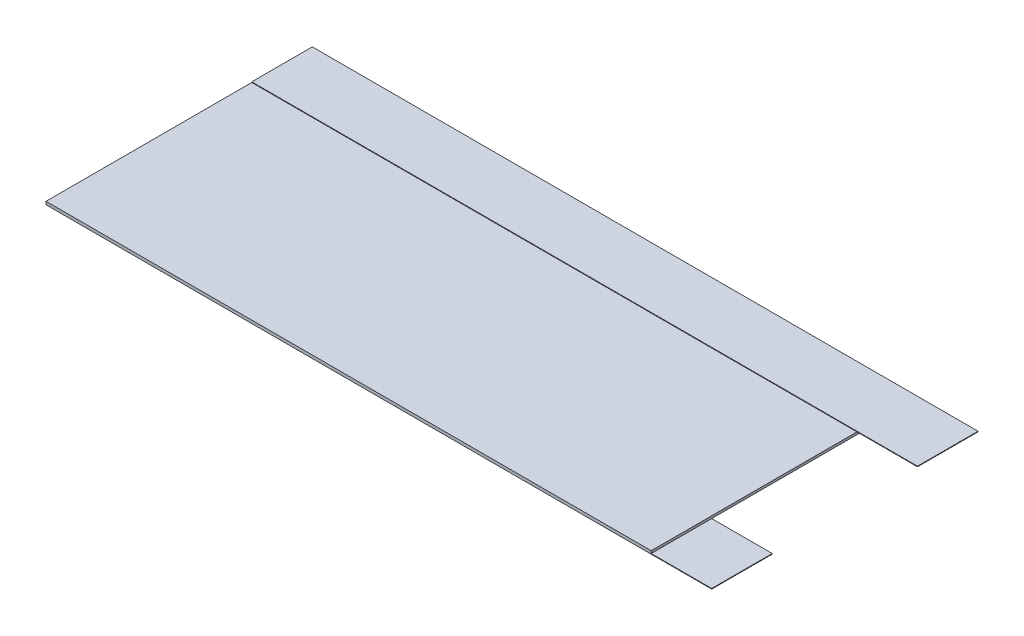
ISO-10303-21;
HEADER;
FILE_DESCRIPTION(('STEP AP214'),'2;1');
FILE_NAME('part.step','',(''),(''),'','','');
FILE_SCHEMA(('AUTOMOTIVE_DESIGN { 1 0 10303 214 1 1 1 1 }'));
ENDSEC;
DATA;
#1=APPLICATION_CONTEXT('core data for automotive mechanical design processes');
#2=APPLICATION_PROTOCOL_DEFINITION('international standard','automotive_design',2000,#1);
#3=PRODUCT_CONTEXT('',#1,'mechanical');
#4=PRODUCT('Part','Part','',(#3));
#5=PRODUCT_RELATED_PRODUCT_CATEGORY('part','',(#4));
#6=PRODUCT_DEFINITION_FORMATION('','',#4);
#7=PRODUCT_DEFINITION_CONTEXT('part definition',#1,'design');
#8=PRODUCT_DEFINITION('design','',#6,#7);
#9=PRODUCT_DEFINITION_SHAPE('','',#8);
#10=(LENGTH_UNIT() NAMED_UNIT(*) SI_UNIT(.MILLI.,.METRE.));
#11=(NAMED_UNIT(*) PLANE_ANGLE_UNIT() SI_UNIT($,.RADIAN.));
#12=(NAMED_UNIT(*) SI_UNIT($,.STERADIAN.) SOLID_ANGLE_UNIT());
#13=UNCERTAINTY_MEASURE_WITH_UNIT(LENGTH_MEASURE(1.E-05),#10,'distance_accuracy_value','');
#14=(GEOMETRIC_REPRESENTATION_CONTEXT(3) GLOBAL_UNCERTAINTY_ASSIGNED_CONTEXT((#13)) GLOBAL_UNIT_ASSIGNED_CONTEXT((#10,
#11,#12)) REPRESENTATION_CONTEXT('',''));
#15=CARTESIAN_POINT('',(0.,0.,0.));
#16=DIRECTION('',(0.,0.,1.));
#17=DIRECTION('',(1.,0.,0.));
#18=AXIS2_PLACEMENT_3D('',#15,#16,#17);
#19=CARTESIAN_POINT('',(0.,-0.1,0.));
#20=DIRECTION('',(0.,1.,0.));
#21=DIRECTION('',(0.,0.,1.));
#22=AXIS2_PLACEMENT_3D('',#19,#20,#21);
#23=PLANE('',#22);
#24=DIRECTION('',(1.,0.,0.));
#25=VECTOR('',#24,1.);
#26=CARTESIAN_POINT('',(-25.,-0.1,6.));
#27=LINE('',#26,#25);
#28=CARTESIAN_POINT('',(-25.,-0.1,6.));
#29=VERTEX_POINT('',#28);
#30=CARTESIAN_POINT('',(25.,-0.1,6.));
#31=VERTEX_POINT('',#30);
#32=EDGE_CURVE('E54',#29,#31,#27,.T.);
#33=ORIENTED_EDGE('',*,*,#32,.F.);
#34=DIRECTION('',(0.,0.,-1.));
#35=VECTOR('',#34,1.);
#36=CARTESIAN_POINT('',(-25.,-0.1,-11.));
#37=LINE('',#36,#35);
#38=CARTESIAN_POINT('',(-25.,-0.1,-11.));
#39=VERTEX_POINT('',#38);
#40=EDGE_CURVE('E190',#29,#39,#37,.T.);
#41=ORIENTED_EDGE('',*,*,#40,.T.);
#42=DIRECTION('',(1.,0.,0.));
#43=VECTOR('',#42,1.);
#44=CARTESIAN_POINT('',(-25.,-0.1,-11.));
#45=LINE('',#44,#43);
#46=CARTESIAN_POINT('',(25.,-0.1,-11.));
#47=VERTEX_POINT('',#46);
#48=EDGE_CURVE('E59',#39,#47,#45,.T.);
#49=ORIENTED_EDGE('',*,*,#48,.T.);
#50=DIRECTION('',(0.,0.,1.));
#51=VECTOR('',#50,1.);
#52=CARTESIAN_POINT('',(25.,-0.1,-11.));
#53=LINE('',#52,#51);
#54=EDGE_CURVE('E202',#47,#31,#53,.T.);
#55=ORIENTED_EDGE('',*,*,#54,.T.);
#56=EDGE_LOOP('',(#33,#41,#49,#55));
#57=FACE_BOUND('',#56,.T.);
#58=ADVANCED_FACE('F37',(#57),#23,.F.);
#59=CARTESIAN_POINT('',(25.,-0.1,-11.));
#60=DIRECTION('',(-1.,0.,0.));
#61=DIRECTION('',(0.,0.,-1.));
#62=AXIS2_PLACEMENT_3D('',#59,#60,#61);
#63=PLANE('',#62);
#64=DIRECTION('',(0.,1.,0.));
#65=VECTOR('',#64,1.);
#66=CARTESIAN_POINT('',(25.,-0.1,-11.));
#67=LINE('',#66,#65);
#68=CARTESIAN_POINT('',(25.,0.1,-11.));
#69=VERTEX_POINT('',#68);
#70=EDGE_CURVE('E211',#47,#69,#67,.T.);
#71=ORIENTED_EDGE('',*,*,#70,.T.);
#72=DIRECTION('',(0.,0.,-1.));
#73=VECTOR('',#72,1.);
#74=CARTESIAN_POINT('',(25.,0.1,11.));
#75=LINE('',#74,#73);
#76=CARTESIAN_POINT('',(25.,0.1,-6.));
#77=VERTEX_POINT('',#76);
#78=EDGE_CURVE('E146',#77,#69,#75,.T.);
#79=ORIENTED_EDGE('',*,*,#78,.F.);
#80=CARTESIAN_POINT('',(25.,0.1,11.));
#81=VERTEX_POINT('',#80);
#82=EDGE_CURVE('E149',#81,#77,#75,.T.);
#83=ORIENTED_EDGE('',*,*,#82,.F.);
#84=DIRECTION('',(0.,1.,0.));
#85=VECTOR('',#84,1.);
#86=CARTESIAN_POINT('',(25.,-0.1,11.));
#87=LINE('',#86,#85);
#88=CARTESIAN_POINT('',(25.,-0.1,11.));
#89=VERTEX_POINT('',#88);
#90=EDGE_CURVE('E11',#89,#81,#87,.T.);
#91=ORIENTED_EDGE('',*,*,#90,.F.);
#92=EDGE_CURVE('E196',#31,#89,#53,.T.);
#93=ORIENTED_EDGE('',*,*,#92,.F.);
#94=ORIENTED_EDGE('',*,*,#54,.F.);
#95=EDGE_LOOP('',(#71,#79,#83,#91,#93,#94));
#96=FACE_BOUND('',#95,.T.);
#97=ADVANCED_FACE('F39',(#96),#63,.F.);
#98=CARTESIAN_POINT('',(-25.,-0.1,11.));
#99=DIRECTION('',(0.,0.,-1.));
#100=DIRECTION('',(1.,0.,0.));
#101=AXIS2_PLACEMENT_3D('',#98,#99,#100);
#102=PLANE('',#101);
#103=ORIENTED_EDGE('',*,*,#90,.T.);
#104=DIRECTION('',(1.,0.,0.));
#105=VECTOR('',#104,1.);
#106=CARTESIAN_POINT('',(-25.,0.1,11.));
#107=LINE('',#106,#105);
#108=CARTESIAN_POINT('',(-25.,0.1,11.));
#109=VERTEX_POINT('',#108);
#110=EDGE_CURVE('E169',#109,#81,#107,.T.);
#111=ORIENTED_EDGE('',*,*,#110,.F.);
#112=DIRECTION('',(0.,1.,0.));
#113=VECTOR('',#112,1.);
#114=CARTESIAN_POINT('',(-25.,-0.1,11.));
#115=LINE('',#114,#113);
#116=CARTESIAN_POINT('',(-25.,-0.15,11.));
#117=VERTEX_POINT('',#116);
#118=EDGE_CURVE('E46',#117,#109,#115,.T.);
#119=ORIENTED_EDGE('',*,*,#118,.F.);
#120=DIRECTION('',(-1.,0.,0.));
#121=VECTOR('',#120,1.);
#122=CARTESIAN_POINT('',(-25.,-0.15,11.));
#123=LINE('',#122,#121);
#124=CARTESIAN_POINT('',(30.,-0.15,11.));
#125=VERTEX_POINT('',#124);
#126=EDGE_CURVE('E185',#125,#117,#123,.T.);
#127=ORIENTED_EDGE('',*,*,#126,.F.);
#128=DIRECTION('',(0.,1.,0.));
#129=VECTOR('',#128,1.);
#130=CARTESIAN_POINT('',(30.,-0.15,11.));
#131=LINE('',#130,#129);
#132=CARTESIAN_POINT('',(30.,-0.1,11.));
#133=VERTEX_POINT('',#132);
#134=EDGE_CURVE('E226',#125,#133,#131,.T.);
#135=ORIENTED_EDGE('',*,*,#134,.T.);
#136=DIRECTION('',(-1.,0.,0.));
#137=VECTOR('',#136,1.);
#138=CARTESIAN_POINT('',(-25.,-0.1,11.));
#139=LINE('',#138,#137);
#140=EDGE_CURVE('E206',#133,#89,#139,.T.);
#141=ORIENTED_EDGE('',*,*,#140,.T.);
#142=EDGE_LOOP('',(#103,#111,#119,#127,#135,#141));
#143=FACE_BOUND('',#142,.T.);
#144=ADVANCED_FACE('F219',(#143),#102,.F.);
#145=CARTESIAN_POINT('',(-25.,-0.1,-11.));
#146=DIRECTION('',(1.,0.,0.));
#147=DIRECTION('',(0.,0.,1.));
#148=AXIS2_PLACEMENT_3D('',#145,#146,#147);
#149=PLANE('',#148);
#150=ORIENTED_EDGE('',*,*,#118,.T.);
#151=DIRECTION('',(0.,0.,1.));
#152=VECTOR('',#151,1.);
#153=CARTESIAN_POINT('',(-25.,0.1,11.));
#154=LINE('',#153,#152);
#155=CARTESIAN_POINT('',(-25.,0.1,-6.));
#156=VERTEX_POINT('',#155);
#157=EDGE_CURVE('E145',#156,#109,#154,.T.);
#158=ORIENTED_EDGE('',*,*,#157,.F.);
#159=DIRECTION('',(0.,-1.,0.));
#160=VECTOR('',#159,1.);
#161=CARTESIAN_POINT('',(-25.,0.15,-6.));
#162=LINE('',#161,#160);
#163=CARTESIAN_POINT('',(-25.,0.15,-6.));
#164=VERTEX_POINT('',#163);
#165=EDGE_CURVE('E125',#164,#156,#162,.T.);
#166=ORIENTED_EDGE('',*,*,#165,.F.);
#167=DIRECTION('',(0.,0.,1.));
#168=VECTOR('',#167,1.);
#169=CARTESIAN_POINT('',(-25.,0.15,-11.));
#170=LINE('',#169,#168);
#171=CARTESIAN_POINT('',(-25.,0.15,-11.));
#172=VERTEX_POINT('',#171);
#173=EDGE_CURVE('E131',#172,#164,#170,.T.);
#174=ORIENTED_EDGE('',*,*,#173,.F.);
#175=DIRECTION('',(0.,1.,0.));
#176=VECTOR('',#175,1.);
#177=CARTESIAN_POINT('',(-25.,-0.1,-11.));
#178=LINE('',#177,#176);
#179=EDGE_CURVE('E212',#39,#172,#178,.T.);
#180=ORIENTED_EDGE('',*,*,#179,.F.);
#181=ORIENTED_EDGE('',*,*,#40,.F.);
#182=DIRECTION('',(0.,1.,0.));
#183=VECTOR('',#182,1.);
#184=CARTESIAN_POINT('',(-25.,-0.15,6.));
#185=LINE('',#184,#183);
#186=CARTESIAN_POINT('',(-25.,-0.15,6.));
#187=VERTEX_POINT('',#186);
#188=EDGE_CURVE('E193',#187,#29,#185,.T.);
#189=ORIENTED_EDGE('',*,*,#188,.F.);
#190=DIRECTION('',(0.,0.,-1.));
#191=VECTOR('',#190,1.);
#192=CARTESIAN_POINT('',(-25.,-0.15,11.));
#193=LINE('',#192,#191);
#194=EDGE_CURVE('E161',#117,#187,#193,.T.);
#195=ORIENTED_EDGE('',*,*,#194,.F.);
#196=EDGE_LOOP('',(#150,#158,#166,#174,#180,#181,#189,#195));
#197=FACE_BOUND('',#196,.T.);
#198=ADVANCED_FACE('F143',(#197),#149,.F.);
#199=CARTESIAN_POINT('',(-25.,-0.1,-11.));
#200=DIRECTION('',(0.,0.,1.));
#201=DIRECTION('',(-1.,0.,0.));
#202=AXIS2_PLACEMENT_3D('',#199,#200,#201);
#203=PLANE('',#202);
#204=ORIENTED_EDGE('',*,*,#179,.T.);
#205=DIRECTION('',(-1.,0.,0.));
#206=VECTOR('',#205,1.);
#207=CARTESIAN_POINT('',(-25.,0.15,-11.));
#208=LINE('',#207,#206);
#209=CARTESIAN_POINT('',(30.,0.15,-11.));
#210=VERTEX_POINT('',#209);
#211=EDGE_CURVE('E137',#210,#172,#208,.T.);
#212=ORIENTED_EDGE('',*,*,#211,.F.);
#213=DIRECTION('',(0.,-1.,0.));
#214=VECTOR('',#213,1.);
#215=CARTESIAN_POINT('',(30.,0.15,-11.));
#216=LINE('',#215,#214);
#217=CARTESIAN_POINT('',(30.,0.1,-11.));
#218=VERTEX_POINT('',#217);
#219=EDGE_CURVE('E151',#210,#218,#216,.T.);
#220=ORIENTED_EDGE('',*,*,#219,.T.);
#221=DIRECTION('',(-1.,0.,0.));
#222=VECTOR('',#221,1.);
#223=CARTESIAN_POINT('',(-25.,0.1,-11.));
#224=LINE('',#223,#222);
#225=EDGE_CURVE('E140',#218,#69,#224,.T.);
#226=ORIENTED_EDGE('',*,*,#225,.T.);
#227=ORIENTED_EDGE('',*,*,#70,.F.);
#228=ORIENTED_EDGE('',*,*,#48,.F.);
#229=EDGE_LOOP('',(#204,#212,#220,#226,#227,#228));
#230=FACE_BOUND('',#229,.T.);
#231=ADVANCED_FACE('F258',(#230),#203,.F.);
#232=CARTESIAN_POINT('',(0.,-0.1,0.));
#233=DIRECTION('',(0.,-1.,0.));
#234=DIRECTION('',(0.,0.,-1.));
#235=AXIS2_PLACEMENT_3D('',#232,#233,#234);
#236=PLANE('',#235);
#237=CARTESIAN_POINT('',(30.,-0.1,6.));
#238=VERTEX_POINT('',#237);
#239=EDGE_CURVE('E173',#31,#238,#27,.T.);
#240=ORIENTED_EDGE('',*,*,#239,.F.);
#241=ORIENTED_EDGE('',*,*,#92,.T.);
#242=ORIENTED_EDGE('',*,*,#140,.F.);
#243=DIRECTION('',(0.,0.,1.));
#244=VECTOR('',#243,1.);
#245=CARTESIAN_POINT('',(30.,-0.1,11.));
#246=LINE('',#245,#244);
#247=EDGE_CURVE('E180',#238,#133,#246,.T.);
#248=ORIENTED_EDGE('',*,*,#247,.F.);
#249=EDGE_LOOP('',(#240,#241,#242,#248));
#250=FACE_BOUND('',#249,.T.);
#251=ADVANCED_FACE('F235',(#250),#236,.F.);
#252=CARTESIAN_POINT('',(-25.,-0.15,6.));
#253=DIRECTION('',(0.,0.,1.));
#254=DIRECTION('',(-1.,0.,0.));
#255=AXIS2_PLACEMENT_3D('',#252,#253,#254);
#256=PLANE('',#255);
#257=ORIENTED_EDGE('',*,*,#32,.T.);
#258=ORIENTED_EDGE('',*,*,#239,.T.);
#259=DIRECTION('',(0.,1.,0.));
#260=VECTOR('',#259,1.);
#261=CARTESIAN_POINT('',(30.,-0.15,6.));
#262=LINE('',#261,#260);
#263=CARTESIAN_POINT('',(30.,-0.15,6.));
#264=VERTEX_POINT('',#263);
#265=EDGE_CURVE('E197',#264,#238,#262,.T.);
#266=ORIENTED_EDGE('',*,*,#265,.F.);
#267=DIRECTION('',(1.,0.,0.));
#268=VECTOR('',#267,1.);
#269=CARTESIAN_POINT('',(-25.,-0.15,6.));
#270=LINE('',#269,#268);
#271=EDGE_CURVE('E228',#187,#264,#270,.T.);
#272=ORIENTED_EDGE('',*,*,#271,.F.);
#273=ORIENTED_EDGE('',*,*,#188,.T.);
#274=EDGE_LOOP('',(#257,#258,#266,#272,#273));
#275=FACE_BOUND('',#274,.T.);
#276=ADVANCED_FACE('F259',(#275),#256,.F.);
#277=CARTESIAN_POINT('',(30.,-0.15,11.));
#278=DIRECTION('',(-1.,0.,0.));
#279=DIRECTION('',(0.,0.,-1.));
#280=AXIS2_PLACEMENT_3D('',#277,#278,#279);
#281=PLANE('',#280);
#282=ORIENTED_EDGE('',*,*,#247,.T.);
#283=ORIENTED_EDGE('',*,*,#134,.F.);
#284=DIRECTION('',(0.,0.,1.));
#285=VECTOR('',#284,1.);
#286=CARTESIAN_POINT('',(30.,-0.15,11.));
#287=LINE('',#286,#285);
#288=EDGE_CURVE('E224',#264,#125,#287,.T.);
#289=ORIENTED_EDGE('',*,*,#288,.F.);
#290=ORIENTED_EDGE('',*,*,#265,.T.);
#291=EDGE_LOOP('',(#282,#283,#289,#290));
#292=FACE_BOUND('',#291,.T.);
#293=ADVANCED_FACE('F233',(#292),#281,.F.);
#294=CARTESIAN_POINT('',(0.,-0.15,0.));
#295=DIRECTION('',(0.,-1.,0.));
#296=DIRECTION('',(0.,0.,-1.));
#297=AXIS2_PLACEMENT_3D('',#294,#295,#296);
#298=PLANE('',#297);
#299=ORIENTED_EDGE('',*,*,#194,.T.);
#300=ORIENTED_EDGE('',*,*,#271,.T.);
#301=ORIENTED_EDGE('',*,*,#288,.T.);
#302=ORIENTED_EDGE('',*,*,#126,.T.);
#303=EDGE_LOOP('',(#299,#300,#301,#302));
#304=FACE_BOUND('',#303,.T.);
#305=ADVANCED_FACE('F222',(#304),#298,.T.);
#306=CARTESIAN_POINT('',(0.,0.1,0.));
#307=DIRECTION('',(0.,-1.,0.));
#308=DIRECTION('',(0.,0.,-1.));
#309=AXIS2_PLACEMENT_3D('',#306,#307,#308);
#310=PLANE('',#309);
#311=DIRECTION('',(1.,0.,0.));
#312=VECTOR('',#311,1.);
#313=CARTESIAN_POINT('',(-25.,0.1,-6.));
#314=LINE('',#313,#312);
#315=EDGE_CURVE('E155',#156,#77,#314,.T.);
#316=ORIENTED_EDGE('',*,*,#315,.F.);
#317=ORIENTED_EDGE('',*,*,#157,.T.);
#318=ORIENTED_EDGE('',*,*,#110,.T.);
#319=ORIENTED_EDGE('',*,*,#82,.T.);
#320=EDGE_LOOP('',(#316,#317,#318,#319));
#321=FACE_BOUND('',#320,.T.);
#322=ADVANCED_FACE('F241',(#321),#310,.F.);
#323=CARTESIAN_POINT('',(0.,0.1,0.));
#324=DIRECTION('',(0.,1.,0.));
#325=DIRECTION('',(0.,0.,1.));
#326=AXIS2_PLACEMENT_3D('',#323,#324,#325);
#327=PLANE('',#326);
#328=CARTESIAN_POINT('',(30.,0.1,-6.));
#329=VERTEX_POINT('',#328);
#330=EDGE_CURVE('E243',#77,#329,#314,.T.);
#331=ORIENTED_EDGE('',*,*,#330,.F.);
#332=ORIENTED_EDGE('',*,*,#78,.T.);
#333=ORIENTED_EDGE('',*,*,#225,.F.);
#334=DIRECTION('',(0.,0.,-1.));
#335=VECTOR('',#334,1.);
#336=CARTESIAN_POINT('',(30.,0.1,-11.));
#337=LINE('',#336,#335);
#338=EDGE_CURVE('E242',#329,#218,#337,.T.);
#339=ORIENTED_EDGE('',*,*,#338,.F.);
#340=EDGE_LOOP('',(#331,#332,#333,#339));
#341=FACE_BOUND('',#340,.T.);
#342=ADVANCED_FACE('F330',(#341),#327,.F.);
#343=CARTESIAN_POINT('',(-25.,0.15,-6.));
#344=DIRECTION('',(0.,0.,-1.));
#345=DIRECTION('',(-1.,0.,0.));
#346=AXIS2_PLACEMENT_3D('',#343,#344,#345);
#347=PLANE('',#346);
#348=ORIENTED_EDGE('',*,*,#315,.T.);
#349=ORIENTED_EDGE('',*,*,#330,.T.);
#350=DIRECTION('',(0.,-1.,0.));
#351=VECTOR('',#350,1.);
#352=CARTESIAN_POINT('',(30.,0.15,-6.));
#353=LINE('',#352,#351);
#354=CARTESIAN_POINT('',(30.,0.15,-6.));
#355=VERTEX_POINT('',#354);
#356=EDGE_CURVE('E127',#355,#329,#353,.T.);
#357=ORIENTED_EDGE('',*,*,#356,.F.);
#358=DIRECTION('',(1.,0.,0.));
#359=VECTOR('',#358,1.);
#360=CARTESIAN_POINT('',(-25.,0.15,-6.));
#361=LINE('',#360,#359);
#362=EDGE_CURVE('E120',#164,#355,#361,.T.);
#363=ORIENTED_EDGE('',*,*,#362,.F.);
#364=ORIENTED_EDGE('',*,*,#165,.T.);
#365=EDGE_LOOP('',(#348,#349,#357,#363,#364));
#366=FACE_BOUND('',#365,.T.);
#367=ADVANCED_FACE('F123',(#366),#347,.F.);
#368=CARTESIAN_POINT('',(30.,0.15,-11.));
#369=DIRECTION('',(-1.,0.,0.));
#370=DIRECTION('',(0.,0.,1.));
#371=AXIS2_PLACEMENT_3D('',#368,#369,#370);
#372=PLANE('',#371);
#373=ORIENTED_EDGE('',*,*,#338,.T.);
#374=ORIENTED_EDGE('',*,*,#219,.F.);
#375=DIRECTION('',(0.,0.,-1.));
#376=VECTOR('',#375,1.);
#377=CARTESIAN_POINT('',(30.,0.15,-11.));
#378=LINE('',#377,#376);
#379=EDGE_CURVE('E130',#355,#210,#378,.T.);
#380=ORIENTED_EDGE('',*,*,#379,.F.);
#381=ORIENTED_EDGE('',*,*,#356,.T.);
#382=EDGE_LOOP('',(#373,#374,#380,#381));
#383=FACE_BOUND('',#382,.T.);
#384=ADVANCED_FACE('F256',(#383),#372,.F.);
#385=CARTESIAN_POINT('',(0.,0.15,0.));
#386=DIRECTION('',(0.,1.,0.));
#387=DIRECTION('',(0.,0.,1.));
#388=AXIS2_PLACEMENT_3D('',#385,#386,#387);
#389=PLANE('',#388);
#390=ORIENTED_EDGE('',*,*,#173,.T.);
#391=ORIENTED_EDGE('',*,*,#362,.T.);
#392=ORIENTED_EDGE('',*,*,#379,.T.);
#393=ORIENTED_EDGE('',*,*,#211,.T.);
#394=EDGE_LOOP('',(#390,#391,#392,#393));
#395=FACE_BOUND('',#394,.T.);
#396=ADVANCED_FACE('F135',(#395),#389,.T.);
#397=CLOSED_SHELL('',(#58,#97,#144,#198,#231,#251,#276,#293,#305,#322,#342,#367,#384,#396));
#398=MANIFOLD_SOLID_BREP('B2',#397);
#399=ADVANCED_BREP_SHAPE_REPRESENTATION('',(#18,#398),#14);
#400=SHAPE_DEFINITION_REPRESENTATION(#9,#399);
ENDSEC;
END-ISO-10303-21;
